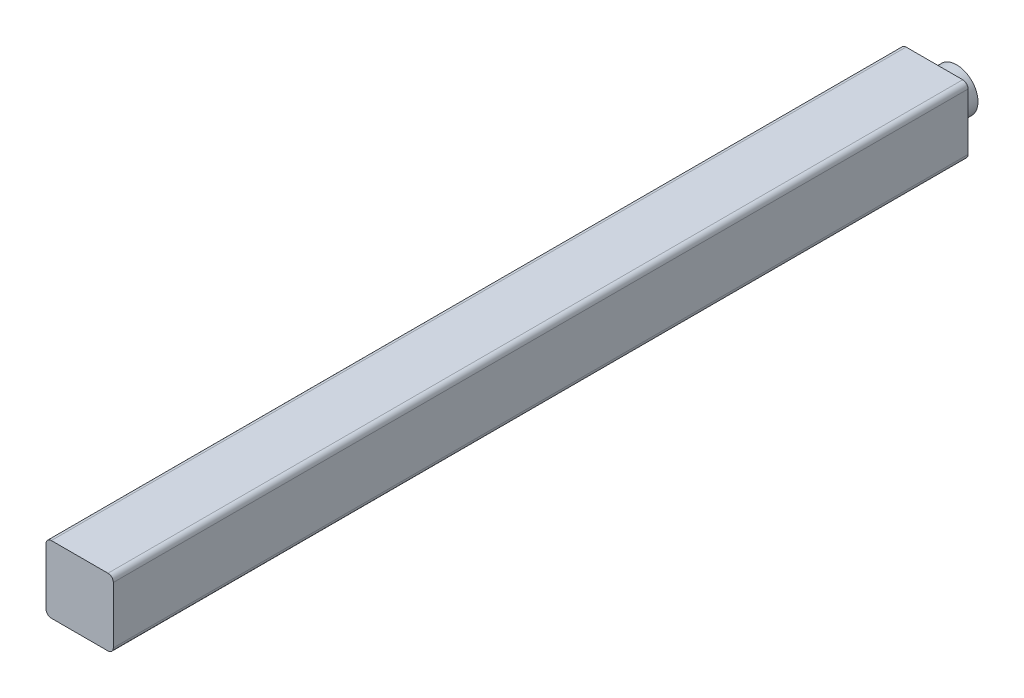
ISO-10303-21;
HEADER;
FILE_DESCRIPTION(('STEP AP214'),'2;1');
FILE_NAME('part.step','',(''),(''),'','','');
FILE_SCHEMA(('AUTOMOTIVE_DESIGN { 1 0 10303 214 1 1 1 1 }'));
ENDSEC;
DATA;
#1=APPLICATION_CONTEXT('core data for automotive mechanical design processes');
#2=APPLICATION_PROTOCOL_DEFINITION('international standard','automotive_design',2000,#1);
#3=PRODUCT_CONTEXT('',#1,'mechanical');
#4=PRODUCT('Part','Part','',(#3));
#5=PRODUCT_RELATED_PRODUCT_CATEGORY('part','',(#4));
#6=PRODUCT_DEFINITION_FORMATION('','',#4);
#7=PRODUCT_DEFINITION_CONTEXT('part definition',#1,'design');
#8=PRODUCT_DEFINITION('design','',#6,#7);
#9=PRODUCT_DEFINITION_SHAPE('','',#8);
#10=(LENGTH_UNIT() NAMED_UNIT(*) SI_UNIT(.MILLI.,.METRE.));
#11=(NAMED_UNIT(*) PLANE_ANGLE_UNIT() SI_UNIT($,.RADIAN.));
#12=(NAMED_UNIT(*) SI_UNIT($,.STERADIAN.) SOLID_ANGLE_UNIT());
#13=UNCERTAINTY_MEASURE_WITH_UNIT(LENGTH_MEASURE(1.E-05),#10,'distance_accuracy_value','');
#14=(GEOMETRIC_REPRESENTATION_CONTEXT(3) GLOBAL_UNCERTAINTY_ASSIGNED_CONTEXT((#13)) GLOBAL_UNIT_ASSIGNED_CONTEXT((#10,
#11,#12)) REPRESENTATION_CONTEXT('',''));
#15=CARTESIAN_POINT('',(0.,0.,0.));
#16=DIRECTION('',(0.,0.,1.));
#17=DIRECTION('',(1.,0.,0.));
#18=AXIS2_PLACEMENT_3D('',#15,#16,#17);
#19=CARTESIAN_POINT('',(2.9,0.25,0.));
#20=DIRECTION('',(0.,0.,1.));
#21=DIRECTION('',(1.,0.,0.));
#22=AXIS2_PLACEMENT_3D('',#19,#20,#21);
#23=PLANE('',#22);
#24=CARTESIAN_POINT('',(2.9,0.25,0.));
#25=DIRECTION('',(0.,0.,1.));
#26=DIRECTION('',(1.,0.,0.));
#27=AXIS2_PLACEMENT_3D('',#24,#25,#26);
#28=CIRCLE('',#27,0.25);
#29=CARTESIAN_POINT('',(2.9,0.,0.));
#30=VERTEX_POINT('',#29);
#31=CARTESIAN_POINT('',(3.15,0.25,0.));
#32=VERTEX_POINT('',#31);
#33=EDGE_CURVE('E138',#30,#32,#28,.T.);
#34=ORIENTED_EDGE('',*,*,#33,.F.);
#35=DIRECTION('',(1.,0.,0.));
#36=VECTOR('',#35,1.);
#37=CARTESIAN_POINT('',(0.250000000000002,0.,0.));
#38=LINE('',#37,#36);
#39=CARTESIAN_POINT('',(0.250000000000002,0.,0.));
#40=VERTEX_POINT('',#39);
#41=EDGE_CURVE('E92',#40,#30,#38,.T.);
#42=ORIENTED_EDGE('',*,*,#41,.F.);
#43=CARTESIAN_POINT('',(0.25,0.25,0.));
#44=DIRECTION('',(0.,0.,1.));
#45=DIRECTION('',(1.,0.,0.));
#46=AXIS2_PLACEMENT_3D('',#43,#44,#45);
#47=CIRCLE('',#46,0.25);
#48=CARTESIAN_POINT('',(0.,0.250000000000002,0.));
#49=VERTEX_POINT('',#48);
#50=EDGE_CURVE('E86',#49,#40,#47,.T.);
#51=ORIENTED_EDGE('',*,*,#50,.F.);
#52=DIRECTION('',(0.,-1.,0.));
#53=VECTOR('',#52,1.);
#54=CARTESIAN_POINT('',(0.,0.250000000000002,0.));
#55=LINE('',#54,#53);
#56=CARTESIAN_POINT('',(0.,2.9,0.));
#57=VERTEX_POINT('',#56);
#58=EDGE_CURVE('E128',#57,#49,#55,.T.);
#59=ORIENTED_EDGE('',*,*,#58,.F.);
#60=CARTESIAN_POINT('',(0.25,2.9,0.));
#61=DIRECTION('',(0.,0.,1.));
#62=DIRECTION('',(1.,0.,0.));
#63=AXIS2_PLACEMENT_3D('',#60,#61,#62);
#64=CIRCLE('',#63,0.25);
#65=CARTESIAN_POINT('',(0.25,3.15,0.));
#66=VERTEX_POINT('',#65);
#67=EDGE_CURVE('E149',#66,#57,#64,.T.);
#68=ORIENTED_EDGE('',*,*,#67,.F.);
#69=DIRECTION('',(-1.,0.,0.));
#70=VECTOR('',#69,1.);
#71=CARTESIAN_POINT('',(0.25,3.15,0.));
#72=LINE('',#71,#70);
#73=CARTESIAN_POINT('',(2.9,3.15,0.));
#74=VERTEX_POINT('',#73);
#75=EDGE_CURVE('E146',#74,#66,#72,.T.);
#76=ORIENTED_EDGE('',*,*,#75,.F.);
#77=CARTESIAN_POINT('',(2.9,2.9,0.));
#78=DIRECTION('',(0.,0.,1.));
#79=DIRECTION('',(-1.,0.,0.));
#80=AXIS2_PLACEMENT_3D('',#77,#78,#79);
#81=CIRCLE('',#80,0.25);
#82=CARTESIAN_POINT('',(3.15,2.9,0.));
#83=VERTEX_POINT('',#82);
#84=EDGE_CURVE('E144',#83,#74,#81,.T.);
#85=ORIENTED_EDGE('',*,*,#84,.F.);
#86=DIRECTION('',(0.,1.,0.));
#87=VECTOR('',#86,1.);
#88=CARTESIAN_POINT('',(3.15,0.25,0.));
#89=LINE('',#88,#87);
#90=EDGE_CURVE('E141',#32,#83,#89,.T.);
#91=ORIENTED_EDGE('',*,*,#90,.F.);
#92=EDGE_LOOP('',(#34,#42,#51,#59,#68,#76,#85,#91));
#93=FACE_BOUND('',#92,.T.);
#94=CARTESIAN_POINT('',(1.615,1.615,0.));
#95=DIRECTION('',(0.,0.,1.));
#96=DIRECTION('',(1.,0.,0.));
#97=AXIS2_PLACEMENT_3D('',#94,#95,#96);
#98=CIRCLE('',#97,1.);
#99=CARTESIAN_POINT('',(2.615,1.615,0.));
#100=VERTEX_POINT('',#99);
#101=EDGE_CURVE('E11',#100,#100,#98,.F.);
#102=ORIENTED_EDGE('',*,*,#101,.F.);
#103=EDGE_LOOP('',(#102));
#104=FACE_BOUND('',#103,.T.);
#105=ADVANCED_FACE('F39',(#93,#104),#23,.F.);
#106=CARTESIAN_POINT('',(2.9,0.25,40.));
#107=DIRECTION('',(0.,0.,-1.));
#108=DIRECTION('',(-1.,0.,0.));
#109=AXIS2_PLACEMENT_3D('',#106,#107,#108);
#110=CYLINDRICAL_SURFACE('',#109,0.25);
#111=ORIENTED_EDGE('',*,*,#33,.T.);
#112=DIRECTION('',(0.,0.,-1.));
#113=VECTOR('',#112,1.);
#114=CARTESIAN_POINT('',(3.15,0.25,40.));
#115=LINE('',#114,#113);
#116=CARTESIAN_POINT('',(3.15,0.25,40.));
#117=VERTEX_POINT('',#116);
#118=EDGE_CURVE('E49',#117,#32,#115,.T.);
#119=ORIENTED_EDGE('',*,*,#118,.F.);
#120=CARTESIAN_POINT('',(2.9,0.25,40.));
#121=DIRECTION('',(0.,0.,1.));
#122=DIRECTION('',(1.,0.,0.));
#123=AXIS2_PLACEMENT_3D('',#120,#121,#122);
#124=CIRCLE('',#123,0.25);
#125=CARTESIAN_POINT('',(2.9,0.,40.));
#126=VERTEX_POINT('',#125);
#127=EDGE_CURVE('E154',#126,#117,#124,.T.);
#128=ORIENTED_EDGE('',*,*,#127,.F.);
#129=DIRECTION('',(0.,0.,-1.));
#130=VECTOR('',#129,1.);
#131=CARTESIAN_POINT('',(2.9,0.,40.));
#132=LINE('',#131,#130);
#133=EDGE_CURVE('E134',#126,#30,#132,.T.);
#134=ORIENTED_EDGE('',*,*,#133,.T.);
#135=EDGE_LOOP('',(#111,#119,#128,#134));
#136=FACE_BOUND('',#135,.T.);
#137=ADVANCED_FACE('F41',(#136),#110,.T.);
#138=CARTESIAN_POINT('',(3.15,0.25,40.));
#139=DIRECTION('',(-1.,0.,0.));
#140=DIRECTION('',(0.,0.,1.));
#141=AXIS2_PLACEMENT_3D('',#138,#139,#140);
#142=PLANE('',#141);
#143=ORIENTED_EDGE('',*,*,#90,.T.);
#144=DIRECTION('',(0.,0.,-1.));
#145=VECTOR('',#144,1.);
#146=CARTESIAN_POINT('',(3.15,2.9,40.));
#147=LINE('',#146,#145);
#148=CARTESIAN_POINT('',(3.15,2.9,40.));
#149=VERTEX_POINT('',#148);
#150=EDGE_CURVE('E166',#149,#83,#147,.T.);
#151=ORIENTED_EDGE('',*,*,#150,.F.);
#152=DIRECTION('',(0.,1.,0.));
#153=VECTOR('',#152,1.);
#154=CARTESIAN_POINT('',(3.15,0.25,40.));
#155=LINE('',#154,#153);
#156=EDGE_CURVE('E101',#117,#149,#155,.T.);
#157=ORIENTED_EDGE('',*,*,#156,.F.);
#158=ORIENTED_EDGE('',*,*,#118,.T.);
#159=EDGE_LOOP('',(#143,#151,#157,#158));
#160=FACE_BOUND('',#159,.T.);
#161=ADVANCED_FACE('F169',(#160),#142,.F.);
#162=CARTESIAN_POINT('',(2.9,2.9,40.));
#163=DIRECTION('',(0.,0.,-1.));
#164=DIRECTION('',(-1.,0.,0.));
#165=AXIS2_PLACEMENT_3D('',#162,#163,#164);
#166=CYLINDRICAL_SURFACE('',#165,0.25);
#167=ORIENTED_EDGE('',*,*,#84,.T.);
#168=DIRECTION('',(0.,0.,-1.));
#169=VECTOR('',#168,1.);
#170=CARTESIAN_POINT('',(2.9,3.15,40.));
#171=LINE('',#170,#169);
#172=CARTESIAN_POINT('',(2.9,3.15,40.));
#173=VERTEX_POINT('',#172);
#174=EDGE_CURVE('E162',#173,#74,#171,.T.);
#175=ORIENTED_EDGE('',*,*,#174,.F.);
#176=CARTESIAN_POINT('',(2.9,2.9,40.));
#177=DIRECTION('',(0.,0.,1.));
#178=DIRECTION('',(-1.,0.,0.));
#179=AXIS2_PLACEMENT_3D('',#176,#177,#178);
#180=CIRCLE('',#179,0.25);
#181=EDGE_CURVE('E187',#149,#173,#180,.T.);
#182=ORIENTED_EDGE('',*,*,#181,.F.);
#183=ORIENTED_EDGE('',*,*,#150,.T.);
#184=EDGE_LOOP('',(#167,#175,#182,#183));
#185=FACE_BOUND('',#184,.T.);
#186=ADVANCED_FACE('F180',(#185),#166,.T.);
#187=CARTESIAN_POINT('',(0.25,3.15,40.));
#188=DIRECTION('',(0.,-1.,0.));
#189=DIRECTION('',(0.,0.,-1.));
#190=AXIS2_PLACEMENT_3D('',#187,#188,#189);
#191=PLANE('',#190);
#192=ORIENTED_EDGE('',*,*,#75,.T.);
#193=DIRECTION('',(0.,0.,-1.));
#194=VECTOR('',#193,1.);
#195=CARTESIAN_POINT('',(0.25,3.15,40.));
#196=LINE('',#195,#194);
#197=CARTESIAN_POINT('',(0.25,3.15,40.));
#198=VERTEX_POINT('',#197);
#199=EDGE_CURVE('E158',#198,#66,#196,.T.);
#200=ORIENTED_EDGE('',*,*,#199,.F.);
#201=DIRECTION('',(-1.,0.,0.));
#202=VECTOR('',#201,1.);
#203=CARTESIAN_POINT('',(0.25,3.15,40.));
#204=LINE('',#203,#202);
#205=EDGE_CURVE('E186',#173,#198,#204,.T.);
#206=ORIENTED_EDGE('',*,*,#205,.F.);
#207=ORIENTED_EDGE('',*,*,#174,.T.);
#208=EDGE_LOOP('',(#192,#200,#206,#207));
#209=FACE_BOUND('',#208,.T.);
#210=ADVANCED_FACE('F184',(#209),#191,.F.);
#211=CARTESIAN_POINT('',(0.25,2.9,40.));
#212=DIRECTION('',(0.,0.,-1.));
#213=DIRECTION('',(-1.,0.,0.));
#214=AXIS2_PLACEMENT_3D('',#211,#212,#213);
#215=CYLINDRICAL_SURFACE('',#214,0.25);
#216=ORIENTED_EDGE('',*,*,#67,.T.);
#217=DIRECTION('',(0.,0.,-1.));
#218=VECTOR('',#217,1.);
#219=CARTESIAN_POINT('',(0.,2.9,40.));
#220=LINE('',#219,#218);
#221=CARTESIAN_POINT('',(0.,2.9,40.));
#222=VERTEX_POINT('',#221);
#223=EDGE_CURVE('E129',#222,#57,#220,.T.);
#224=ORIENTED_EDGE('',*,*,#223,.F.);
#225=CARTESIAN_POINT('',(0.25,2.9,40.));
#226=DIRECTION('',(0.,0.,1.));
#227=DIRECTION('',(1.,0.,0.));
#228=AXIS2_PLACEMENT_3D('',#225,#226,#227);
#229=CIRCLE('',#228,0.25);
#230=EDGE_CURVE('E120',#198,#222,#229,.T.);
#231=ORIENTED_EDGE('',*,*,#230,.F.);
#232=ORIENTED_EDGE('',*,*,#199,.T.);
#233=EDGE_LOOP('',(#216,#224,#231,#232));
#234=FACE_BOUND('',#233,.T.);
#235=ADVANCED_FACE('F218',(#234),#215,.T.);
#236=CARTESIAN_POINT('',(0.,0.250000000000002,40.));
#237=DIRECTION('',(1.,0.,0.));
#238=DIRECTION('',(0.,0.,-1.));
#239=AXIS2_PLACEMENT_3D('',#236,#237,#238);
#240=PLANE('',#239);
#241=ORIENTED_EDGE('',*,*,#58,.T.);
#242=DIRECTION('',(0.,0.,-1.));
#243=VECTOR('',#242,1.);
#244=CARTESIAN_POINT('',(0.,0.250000000000002,40.));
#245=LINE('',#244,#243);
#246=CARTESIAN_POINT('',(0.,0.250000000000002,40.));
#247=VERTEX_POINT('',#246);
#248=EDGE_CURVE('E125',#247,#49,#245,.T.);
#249=ORIENTED_EDGE('',*,*,#248,.F.);
#250=DIRECTION('',(0.,-1.,0.));
#251=VECTOR('',#250,1.);
#252=CARTESIAN_POINT('',(0.,0.250000000000002,40.));
#253=LINE('',#252,#251);
#254=EDGE_CURVE('E114',#222,#247,#253,.T.);
#255=ORIENTED_EDGE('',*,*,#254,.F.);
#256=ORIENTED_EDGE('',*,*,#223,.T.);
#257=EDGE_LOOP('',(#241,#249,#255,#256));
#258=FACE_BOUND('',#257,.T.);
#259=ADVANCED_FACE('F126',(#258),#240,.F.);
#260=CARTESIAN_POINT('',(0.25,0.25,40.));
#261=DIRECTION('',(0.,0.,-1.));
#262=DIRECTION('',(-1.,0.,0.));
#263=AXIS2_PLACEMENT_3D('',#260,#261,#262);
#264=CYLINDRICAL_SURFACE('',#263,0.25);
#265=ORIENTED_EDGE('',*,*,#50,.T.);
#266=DIRECTION('',(0.,0.,-1.));
#267=VECTOR('',#266,1.);
#268=CARTESIAN_POINT('',(0.250000000000002,0.,40.));
#269=LINE('',#268,#267);
#270=CARTESIAN_POINT('',(0.250000000000002,0.,40.));
#271=VERTEX_POINT('',#270);
#272=EDGE_CURVE('E130',#271,#40,#269,.T.);
#273=ORIENTED_EDGE('',*,*,#272,.F.);
#274=CARTESIAN_POINT('',(0.25,0.25,40.));
#275=DIRECTION('',(0.,0.,1.));
#276=DIRECTION('',(1.,0.,0.));
#277=AXIS2_PLACEMENT_3D('',#274,#275,#276);
#278=CIRCLE('',#277,0.25);
#279=EDGE_CURVE('E118',#247,#271,#278,.T.);
#280=ORIENTED_EDGE('',*,*,#279,.F.);
#281=ORIENTED_EDGE('',*,*,#248,.T.);
#282=EDGE_LOOP('',(#265,#273,#280,#281));
#283=FACE_BOUND('',#282,.T.);
#284=ADVANCED_FACE('F132',(#283),#264,.T.);
#285=CARTESIAN_POINT('',(0.250000000000002,0.,40.));
#286=DIRECTION('',(0.,1.,0.));
#287=DIRECTION('',(0.,0.,1.));
#288=AXIS2_PLACEMENT_3D('',#285,#286,#287);
#289=PLANE('',#288);
#290=ORIENTED_EDGE('',*,*,#41,.T.);
#291=ORIENTED_EDGE('',*,*,#133,.F.);
#292=DIRECTION('',(1.,0.,0.));
#293=VECTOR('',#292,1.);
#294=CARTESIAN_POINT('',(0.250000000000002,0.,40.));
#295=LINE('',#294,#293);
#296=EDGE_CURVE('E57',#271,#126,#295,.T.);
#297=ORIENTED_EDGE('',*,*,#296,.F.);
#298=ORIENTED_EDGE('',*,*,#272,.T.);
#299=EDGE_LOOP('',(#290,#291,#297,#298));
#300=FACE_BOUND('',#299,.T.);
#301=ADVANCED_FACE('F211',(#300),#289,.F.);
#302=CARTESIAN_POINT('',(2.9,0.25,40.));
#303=DIRECTION('',(0.,0.,1.));
#304=DIRECTION('',(1.,0.,0.));
#305=AXIS2_PLACEMENT_3D('',#302,#303,#304);
#306=PLANE('',#305);
#307=ORIENTED_EDGE('',*,*,#127,.T.);
#308=ORIENTED_EDGE('',*,*,#156,.T.);
#309=ORIENTED_EDGE('',*,*,#181,.T.);
#310=ORIENTED_EDGE('',*,*,#205,.T.);
#311=ORIENTED_EDGE('',*,*,#230,.T.);
#312=ORIENTED_EDGE('',*,*,#254,.T.);
#313=ORIENTED_EDGE('',*,*,#279,.T.);
#314=ORIENTED_EDGE('',*,*,#296,.T.);
#315=EDGE_LOOP('',(#307,#308,#309,#310,#311,#312,#313,#314));
#316=FACE_BOUND('',#315,.T.);
#317=ADVANCED_FACE('F116',(#316),#306,.T.);
#318=CARTESIAN_POINT('',(1.615,1.615,-1.));
#319=DIRECTION('',(0.,0.,1.));
#320=DIRECTION('',(1.,0.,0.));
#321=AXIS2_PLACEMENT_3D('',#318,#319,#320);
#322=CYLINDRICAL_SURFACE('',#321,1.);
#323=CARTESIAN_POINT('',(1.615,1.615,-1.));
#324=DIRECTION('',(0.,0.,-1.));
#325=DIRECTION('',(-1.,0.,0.));
#326=AXIS2_PLACEMENT_3D('',#323,#324,#325);
#327=CIRCLE('',#326,1.);
#328=CARTESIAN_POINT('',(0.615,1.615,-1.));
#329=VERTEX_POINT('',#328);
#330=EDGE_CURVE('E142',#329,#329,#327,.T.);
#331=ORIENTED_EDGE('',*,*,#330,.F.);
#332=EDGE_LOOP('',(#331));
#333=FACE_BOUND('',#332,.T.);
#334=ORIENTED_EDGE('',*,*,#101,.T.);
#335=EDGE_LOOP('',(#334));
#336=FACE_BOUND('',#335,.T.);
#337=ADVANCED_FACE('F199',(#333,#336),#322,.T.);
#338=CARTESIAN_POINT('',(1.615,1.615,-1.));
#339=DIRECTION('',(0.,0.,-1.));
#340=DIRECTION('',(-1.,0.,0.));
#341=AXIS2_PLACEMENT_3D('',#338,#339,#340);
#342=PLANE('',#341);
#343=ORIENTED_EDGE('',*,*,#330,.T.);
#344=EDGE_LOOP('',(#343));
#345=FACE_BOUND('',#344,.T.);
#346=ADVANCED_FACE('F197',(#345),#342,.T.);
#347=CLOSED_SHELL('',(#105,#137,#161,#186,#210,#235,#259,#284,#301,#317,#337,#346));
#348=MANIFOLD_SOLID_BREP('B2',#347);
#349=ADVANCED_BREP_SHAPE_REPRESENTATION('',(#18,#348),#14);
#350=SHAPE_DEFINITION_REPRESENTATION(#9,#349);
ENDSEC;
END-ISO-10303-21;
